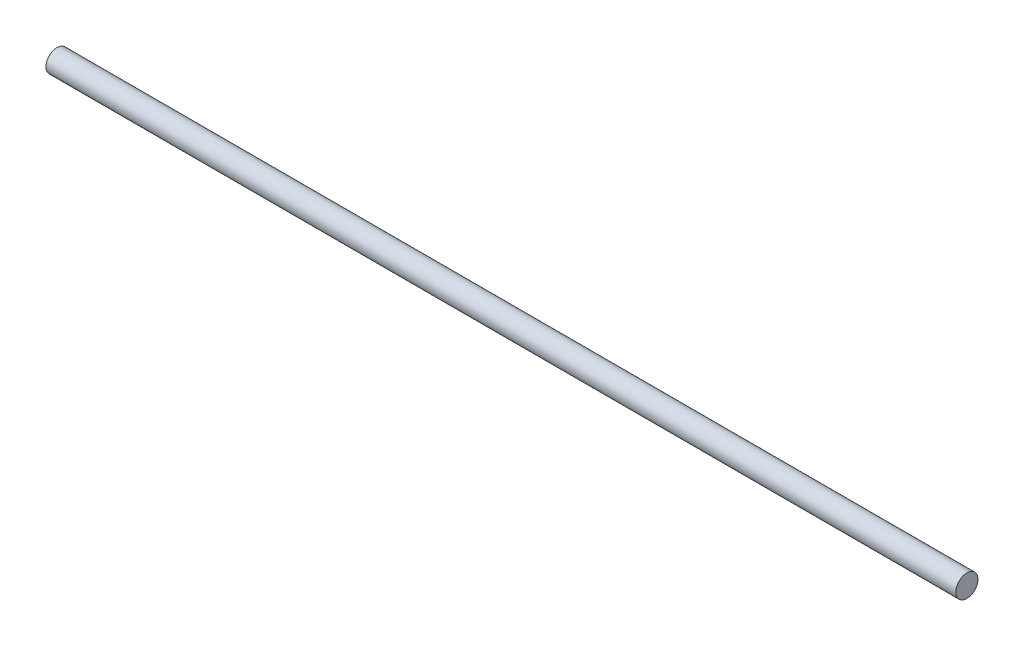
ISO-10303-21;
HEADER;
FILE_DESCRIPTION(('STEP AP214'),'2;1');
FILE_NAME('part.step','',(''),(''),'','','');
FILE_SCHEMA(('AUTOMOTIVE_DESIGN { 1 0 10303 214 1 1 1 1 }'));
ENDSEC;
DATA;
#1=APPLICATION_CONTEXT('core data for automotive mechanical design processes');
#2=APPLICATION_PROTOCOL_DEFINITION('international standard','automotive_design',2000,#1);
#3=PRODUCT_CONTEXT('',#1,'mechanical');
#4=PRODUCT('Part','Part','',(#3));
#5=PRODUCT_RELATED_PRODUCT_CATEGORY('part','',(#4));
#6=PRODUCT_DEFINITION_FORMATION('','',#4);
#7=PRODUCT_DEFINITION_CONTEXT('part definition',#1,'design');
#8=PRODUCT_DEFINITION('design','',#6,#7);
#9=PRODUCT_DEFINITION_SHAPE('','',#8);
#10=(LENGTH_UNIT() NAMED_UNIT(*) SI_UNIT(.MILLI.,.METRE.));
#11=(NAMED_UNIT(*) PLANE_ANGLE_UNIT() SI_UNIT($,.RADIAN.));
#12=(NAMED_UNIT(*) SI_UNIT($,.STERADIAN.) SOLID_ANGLE_UNIT());
#13=UNCERTAINTY_MEASURE_WITH_UNIT(LENGTH_MEASURE(1.E-05),#10,'distance_accuracy_value','');
#14=(GEOMETRIC_REPRESENTATION_CONTEXT(3) GLOBAL_UNCERTAINTY_ASSIGNED_CONTEXT((#13)) GLOBAL_UNIT_ASSIGNED_CONTEXT((#10,
#11,#12)) REPRESENTATION_CONTEXT('',''));
#15=CARTESIAN_POINT('',(0.,0.,0.));
#16=DIRECTION('',(0.,0.,1.));
#17=DIRECTION('',(1.,0.,0.));
#18=AXIS2_PLACEMENT_3D('',#15,#16,#17);
#19=CARTESIAN_POINT('',(246.,0.,0.));
#20=DIRECTION('',(-1.,0.,0.));
#21=DIRECTION('',(0.,0.,1.));
#22=AXIS2_PLACEMENT_3D('',#19,#20,#21);
#23=CYLINDRICAL_SURFACE('',#22,3.);
#24=CARTESIAN_POINT('',(246.,0.,0.));
#25=DIRECTION('',(1.,0.,0.));
#26=DIRECTION('',(0.,0.,-1.));
#27=AXIS2_PLACEMENT_3D('',#24,#25,#26);
#28=CIRCLE('',#27,3.);
#29=CARTESIAN_POINT('',(246.,0.,-3.));
#30=VERTEX_POINT('',#29);
#31=EDGE_CURVE('E10',#30,#30,#28,.T.);
#32=ORIENTED_EDGE('',*,*,#31,.F.);
#33=EDGE_LOOP('',(#32));
#34=FACE_BOUND('',#33,.T.);
#35=CARTESIAN_POINT('',(0.,0.,0.));
#36=DIRECTION('',(1.,0.,0.));
#37=DIRECTION('',(0.,0.,-1.));
#38=AXIS2_PLACEMENT_3D('',#35,#36,#37);
#39=CIRCLE('',#38,3.);
#40=CARTESIAN_POINT('',(0.,0.,-3.));
#41=VERTEX_POINT('',#40);
#42=EDGE_CURVE('E43',#41,#41,#39,.T.);
#43=ORIENTED_EDGE('',*,*,#42,.T.);
#44=EDGE_LOOP('',(#43));
#45=FACE_BOUND('',#44,.T.);
#46=ADVANCED_FACE('F40',(#34,#45),#23,.T.);
#47=CARTESIAN_POINT('',(246.,0.,0.));
#48=DIRECTION('',(1.,0.,0.));
#49=DIRECTION('',(0.,0.,-1.));
#50=AXIS2_PLACEMENT_3D('',#47,#48,#49);
#51=PLANE('',#50);
#52=ORIENTED_EDGE('',*,*,#31,.T.);
#53=EDGE_LOOP('',(#52));
#54=FACE_BOUND('',#53,.T.);
#55=ADVANCED_FACE('F55',(#54),#51,.T.);
#56=CARTESIAN_POINT('',(0.,0.,0.));
#57=DIRECTION('',(1.,0.,0.));
#58=DIRECTION('',(0.,0.,-1.));
#59=AXIS2_PLACEMENT_3D('',#56,#57,#58);
#60=PLANE('',#59);
#61=ORIENTED_EDGE('',*,*,#42,.F.);
#62=EDGE_LOOP('',(#61));
#63=FACE_BOUND('',#62,.T.);
#64=ADVANCED_FACE('F53',(#63),#60,.F.);
#65=CLOSED_SHELL('',(#46,#55,#64));
#66=MANIFOLD_SOLID_BREP('B2',#65);
#67=ADVANCED_BREP_SHAPE_REPRESENTATION('',(#18,#66),#14);
#68=SHAPE_DEFINITION_REPRESENTATION(#9,#67);
ENDSEC;
END-ISO-10303-21;
